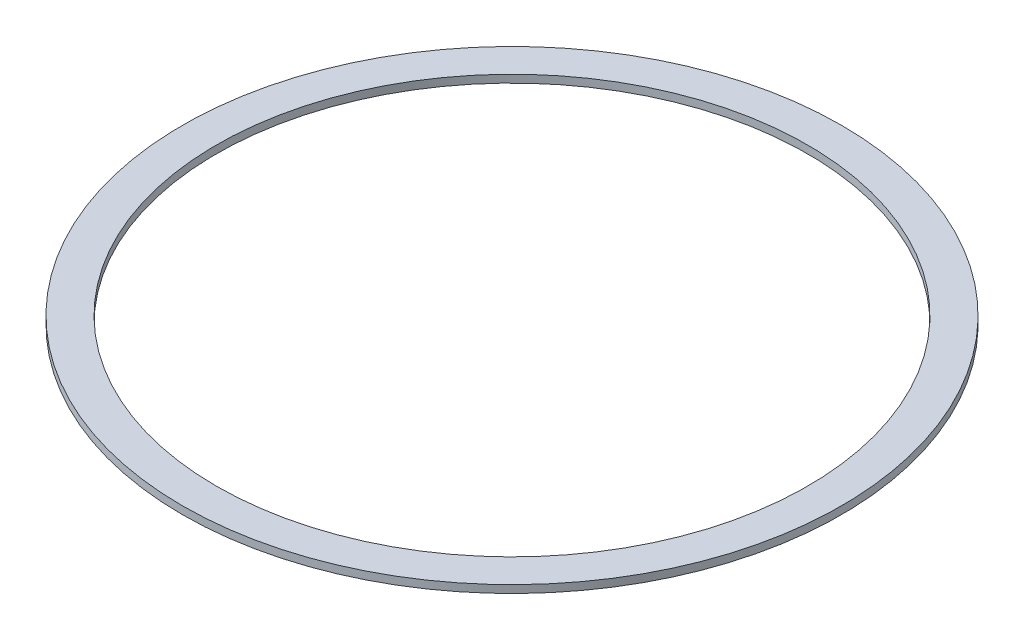
ISO-10303-21;
HEADER;
FILE_DESCRIPTION(('STEP AP214'),'2;1');
FILE_NAME('part.step','',(''),(''),'','','');
FILE_SCHEMA(('AUTOMOTIVE_DESIGN { 1 0 10303 214 1 1 1 1 }'));
ENDSEC;
DATA;
#1=APPLICATION_CONTEXT('core data for automotive mechanical design processes');
#2=APPLICATION_PROTOCOL_DEFINITION('international standard','automotive_design',2000,#1);
#3=PRODUCT_CONTEXT('',#1,'mechanical');
#4=PRODUCT('Part','Part','',(#3));
#5=PRODUCT_RELATED_PRODUCT_CATEGORY('part','',(#4));
#6=PRODUCT_DEFINITION_FORMATION('','',#4);
#7=PRODUCT_DEFINITION_CONTEXT('part definition',#1,'design');
#8=PRODUCT_DEFINITION('design','',#6,#7);
#9=PRODUCT_DEFINITION_SHAPE('','',#8);
#10=(LENGTH_UNIT() NAMED_UNIT(*) SI_UNIT(.MILLI.,.METRE.));
#11=(NAMED_UNIT(*) PLANE_ANGLE_UNIT() SI_UNIT($,.RADIAN.));
#12=(NAMED_UNIT(*) SI_UNIT($,.STERADIAN.) SOLID_ANGLE_UNIT());
#13=UNCERTAINTY_MEASURE_WITH_UNIT(LENGTH_MEASURE(1.E-05),#10,'distance_accuracy_value','');
#14=(GEOMETRIC_REPRESENTATION_CONTEXT(3) GLOBAL_UNCERTAINTY_ASSIGNED_CONTEXT((#13)) GLOBAL_UNIT_ASSIGNED_CONTEXT((#10,
#11,#12)) REPRESENTATION_CONTEXT('',''));
#15=CARTESIAN_POINT('',(0.,0.,0.));
#16=DIRECTION('',(0.,0.,1.));
#17=DIRECTION('',(1.,0.,0.));
#18=AXIS2_PLACEMENT_3D('',#15,#16,#17);
#19=CARTESIAN_POINT('',(0.,3.175,0.));
#20=DIRECTION('',(0.,1.,0.));
#21=DIRECTION('',(0.,0.,1.));
#22=AXIS2_PLACEMENT_3D('',#19,#20,#21);
#23=PLANE('',#22);
#24=CARTESIAN_POINT('',(0.,3.175,0.));
#25=DIRECTION('',(0.,1.,0.));
#26=DIRECTION('',(0.,0.,1.));
#27=AXIS2_PLACEMENT_3D('',#24,#25,#26);
#28=CIRCLE('',#27,135.75);
#29=CARTESIAN_POINT('',(0.,3.175,135.75));
#30=VERTEX_POINT('',#29);
#31=EDGE_CURVE('E10',#30,#30,#28,.T.);
#32=ORIENTED_EDGE('',*,*,#31,.T.);
#33=EDGE_LOOP('',(#32));
#34=FACE_BOUND('',#33,.T.);
#35=CARTESIAN_POINT('',(0.,3.175,0.));
#36=DIRECTION('',(0.,1.,0.));
#37=DIRECTION('',(0.,0.,1.));
#38=AXIS2_PLACEMENT_3D('',#35,#36,#37);
#39=CIRCLE('',#38,121.75);
#40=CARTESIAN_POINT('',(0.,3.175,121.75));
#41=VERTEX_POINT('',#40);
#42=EDGE_CURVE('E39',#41,#41,#39,.T.);
#43=ORIENTED_EDGE('',*,*,#42,.F.);
#44=EDGE_LOOP('',(#43));
#45=FACE_BOUND('',#44,.T.);
#46=ADVANCED_FACE('F28',(#34,#45),#23,.T.);
#47=CARTESIAN_POINT('',(0.,0.,0.));
#48=DIRECTION('',(0.,1.,0.));
#49=DIRECTION('',(0.,0.,1.));
#50=AXIS2_PLACEMENT_3D('',#47,#48,#49);
#51=PLANE('',#50);
#52=CARTESIAN_POINT('',(0.,0.,0.));
#53=DIRECTION('',(0.,1.,0.));
#54=DIRECTION('',(0.,0.,1.));
#55=AXIS2_PLACEMENT_3D('',#52,#53,#54);
#56=CIRCLE('',#55,135.75);
#57=CARTESIAN_POINT('',(0.,0.,135.75));
#58=VERTEX_POINT('',#57);
#59=EDGE_CURVE('E32',#58,#58,#56,.T.);
#60=ORIENTED_EDGE('',*,*,#59,.F.);
#61=EDGE_LOOP('',(#60));
#62=FACE_BOUND('',#61,.T.);
#63=CARTESIAN_POINT('',(0.,0.,0.));
#64=DIRECTION('',(0.,1.,0.));
#65=DIRECTION('',(0.,0.,1.));
#66=AXIS2_PLACEMENT_3D('',#63,#64,#65);
#67=CIRCLE('',#66,121.75);
#68=CARTESIAN_POINT('',(0.,0.,121.75));
#69=VERTEX_POINT('',#68);
#70=EDGE_CURVE('E41',#69,#69,#67,.T.);
#71=ORIENTED_EDGE('',*,*,#70,.T.);
#72=EDGE_LOOP('',(#71));
#73=FACE_BOUND('',#72,.T.);
#74=ADVANCED_FACE('F51',(#62,#73),#51,.F.);
#75=CARTESIAN_POINT('',(0.,3.175,0.));
#76=DIRECTION('',(0.,-1.,0.));
#77=DIRECTION('',(0.,0.,-1.));
#78=AXIS2_PLACEMENT_3D('',#75,#76,#77);
#79=CYLINDRICAL_SURFACE('',#78,135.75);
#80=ORIENTED_EDGE('',*,*,#31,.F.);
#81=EDGE_LOOP('',(#80));
#82=FACE_BOUND('',#81,.T.);
#83=ORIENTED_EDGE('',*,*,#59,.T.);
#84=EDGE_LOOP('',(#83));
#85=FACE_BOUND('',#84,.T.);
#86=ADVANCED_FACE('F30',(#82,#85),#79,.T.);
#87=CARTESIAN_POINT('',(0.,3.175,0.));
#88=DIRECTION('',(0.,-1.,0.));
#89=DIRECTION('',(0.,0.,-1.));
#90=AXIS2_PLACEMENT_3D('',#87,#88,#89);
#91=CYLINDRICAL_SURFACE('',#90,121.75);
#92=ORIENTED_EDGE('',*,*,#42,.T.);
#93=EDGE_LOOP('',(#92));
#94=FACE_BOUND('',#93,.T.);
#95=ORIENTED_EDGE('',*,*,#70,.F.);
#96=EDGE_LOOP('',(#95));
#97=FACE_BOUND('',#96,.T.);
#98=ADVANCED_FACE('F47',(#94,#97),#91,.F.);
#99=CLOSED_SHELL('',(#46,#74,#86,#98));
#100=MANIFOLD_SOLID_BREP('B2',#99);
#101=ADVANCED_BREP_SHAPE_REPRESENTATION('',(#18,#100),#14);
#102=SHAPE_DEFINITION_REPRESENTATION(#9,#101);
ENDSEC;
END-ISO-10303-21;
